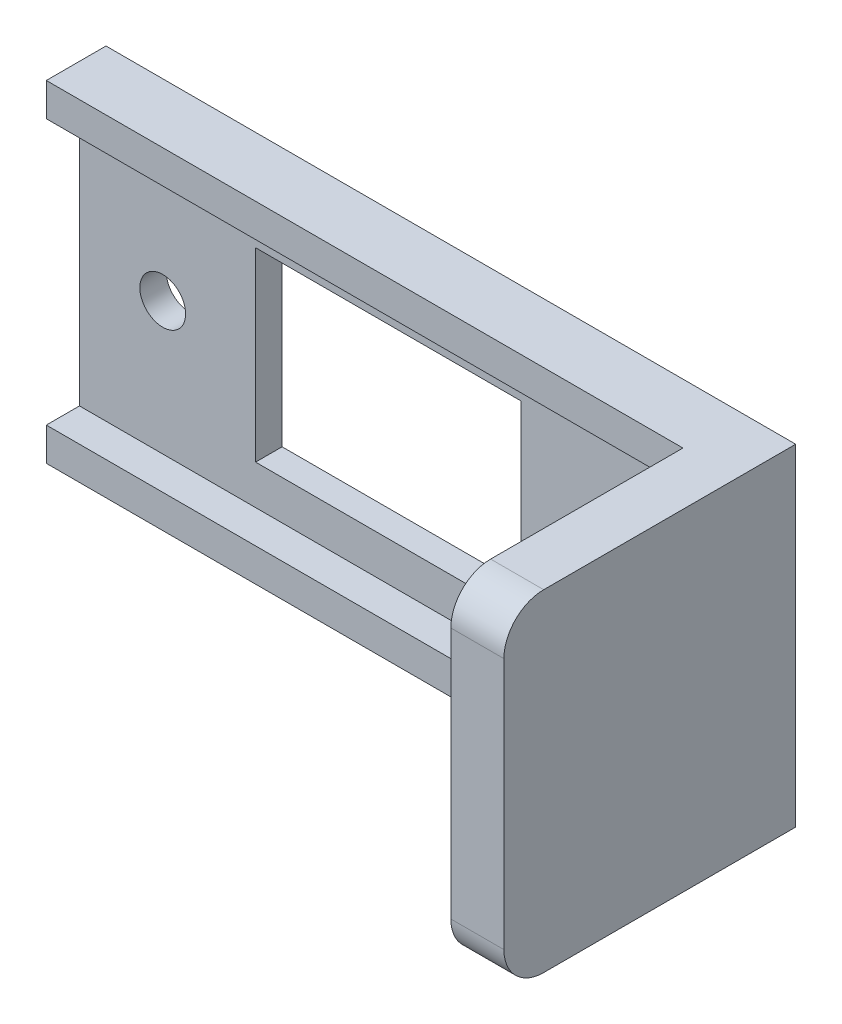
ISO-10303-21;
HEADER;
FILE_DESCRIPTION(('STEP AP214'),'2;1');
FILE_NAME('part.step','',(''),(''),'','','');
FILE_SCHEMA(('AUTOMOTIVE_DESIGN { 1 0 10303 214 1 1 1 1 }'));
ENDSEC;
DATA;
#1=APPLICATION_CONTEXT('core data for automotive mechanical design processes');
#2=APPLICATION_PROTOCOL_DEFINITION('international standard','automotive_design',2000,#1);
#3=PRODUCT_CONTEXT('',#1,'mechanical');
#4=PRODUCT('Part','Part','',(#3));
#5=PRODUCT_RELATED_PRODUCT_CATEGORY('part','',(#4));
#6=PRODUCT_DEFINITION_FORMATION('','',#4);
#7=PRODUCT_DEFINITION_CONTEXT('part definition',#1,'design');
#8=PRODUCT_DEFINITION('design','',#6,#7);
#9=PRODUCT_DEFINITION_SHAPE('','',#8);
#10=(LENGTH_UNIT() NAMED_UNIT(*) SI_UNIT(.MILLI.,.METRE.));
#11=(NAMED_UNIT(*) PLANE_ANGLE_UNIT() SI_UNIT($,.RADIAN.));
#12=(NAMED_UNIT(*) SI_UNIT($,.STERADIAN.) SOLID_ANGLE_UNIT());
#13=UNCERTAINTY_MEASURE_WITH_UNIT(LENGTH_MEASURE(1.E-05),#10,'distance_accuracy_value','');
#14=(GEOMETRIC_REPRESENTATION_CONTEXT(3) GLOBAL_UNCERTAINTY_ASSIGNED_CONTEXT((#13)) GLOBAL_UNIT_ASSIGNED_CONTEXT((#10,
#11,#12)) REPRESENTATION_CONTEXT('',''));
#15=CARTESIAN_POINT('',(0.,0.,0.));
#16=DIRECTION('',(0.,0.,1.));
#17=DIRECTION('',(1.,0.,0.));
#18=AXIS2_PLACEMENT_3D('',#15,#16,#17);
#19=CARTESIAN_POINT('',(0.,0.,2.));
#20=DIRECTION('',(0.,0.,1.));
#21=DIRECTION('',(1.,0.,0.));
#22=AXIS2_PLACEMENT_3D('',#19,#20,#21);
#23=PLANE('',#22);
#24=DIRECTION('',(0.,1.,0.));
#25=VECTOR('',#24,1.);
#26=CARTESIAN_POINT('',(33.2776958672562,-5.53104396084066,2.));
#27=LINE('',#26,#25);
#28=CARTESIAN_POINT('',(33.2776958672562,-19.5310439608407,2.));
#29=VERTEX_POINT('',#28);
#30=CARTESIAN_POINT('',(33.2776958672562,-5.53104396084066,2.));
#31=VERTEX_POINT('',#30);
#32=EDGE_CURVE('E52',#29,#31,#27,.T.);
#33=ORIENTED_EDGE('',*,*,#32,.F.);
#34=DIRECTION('',(1.,0.,0.));
#35=VECTOR('',#34,1.);
#36=CARTESIAN_POINT('',(33.2776958672562,-19.5310439608407,2.));
#37=LINE('',#36,#35);
#38=CARTESIAN_POINT('',(13.2776958672563,-19.5310439608407,2.));
#39=VERTEX_POINT('',#38);
#40=EDGE_CURVE('E168',#39,#29,#37,.T.);
#41=ORIENTED_EDGE('',*,*,#40,.F.);
#42=DIRECTION('',(0.,-1.,0.));
#43=VECTOR('',#42,1.);
#44=CARTESIAN_POINT('',(13.2776958672563,-5.53104396084067,2.));
#45=LINE('',#44,#43);
#46=CARTESIAN_POINT('',(13.2776958672563,-5.53104396084067,2.));
#47=VERTEX_POINT('',#46);
#48=EDGE_CURVE('E153',#47,#39,#45,.T.);
#49=ORIENTED_EDGE('',*,*,#48,.F.);
#50=DIRECTION('',(-1.,0.,0.));
#51=VECTOR('',#50,1.);
#52=CARTESIAN_POINT('',(33.2776958672562,-5.53104396084066,2.));
#53=LINE('',#52,#51);
#54=EDGE_CURVE('E162',#31,#47,#53,.T.);
#55=ORIENTED_EDGE('',*,*,#54,.F.);
#56=EDGE_LOOP('',(#33,#41,#49,#55));
#57=FACE_BOUND('',#56,.T.);
#58=DIRECTION('',(-1.,0.,0.));
#59=VECTOR('',#58,1.);
#60=CARTESIAN_POINT('',(48.,-2.5,2.));
#61=LINE('',#60,#59);
#62=CARTESIAN_POINT('',(48.,-2.5,2.));
#63=VERTEX_POINT('',#62);
#64=CARTESIAN_POINT('',(0.,-2.5,2.));
#65=VERTEX_POINT('',#64);
#66=EDGE_CURVE('E179',#63,#65,#61,.T.);
#67=ORIENTED_EDGE('',*,*,#66,.T.);
#68=DIRECTION('',(0.,-1.,0.));
#69=VECTOR('',#68,1.);
#70=CARTESIAN_POINT('',(0.,0.,2.));
#71=LINE('',#70,#69);
#72=CARTESIAN_POINT('',(0.,-22.5,2.));
#73=VERTEX_POINT('',#72);
#74=EDGE_CURVE('E247',#65,#73,#71,.T.);
#75=ORIENTED_EDGE('',*,*,#74,.T.);
#76=DIRECTION('',(1.,0.,0.));
#77=VECTOR('',#76,1.);
#78=CARTESIAN_POINT('',(48.,-22.5,2.));
#79=LINE('',#78,#77);
#80=CARTESIAN_POINT('',(48.,-22.5,2.));
#81=VERTEX_POINT('',#80);
#82=EDGE_CURVE('E198',#73,#81,#79,.T.);
#83=ORIENTED_EDGE('',*,*,#82,.T.);
#84=DIRECTION('',(0.,1.,0.));
#85=VECTOR('',#84,1.);
#86=CARTESIAN_POINT('',(48.,0.,2.));
#87=LINE('',#86,#85);
#88=EDGE_CURVE('E227',#81,#63,#87,.T.);
#89=ORIENTED_EDGE('',*,*,#88,.T.);
#90=EDGE_LOOP('',(#67,#75,#83,#89));
#91=FACE_BOUND('',#90,.T.);
#92=CARTESIAN_POINT('',(41.2776958672563,-12.5,2.));
#93=DIRECTION('',(0.,0.,1.));
#94=DIRECTION('',(1.,0.,0.));
#95=AXIS2_PLACEMENT_3D('',#92,#93,#94);
#96=CIRCLE('',#95,1.725);
#97=CARTESIAN_POINT('',(43.0026958672563,-12.5,2.));
#98=VERTEX_POINT('',#97);
#99=EDGE_CURVE('E220',#98,#98,#96,.T.);
#100=ORIENTED_EDGE('',*,*,#99,.F.);
#101=EDGE_LOOP('',(#100));
#102=FACE_BOUND('',#101,.T.);
#103=CARTESIAN_POINT('',(6.27769586725625,-12.5,2.));
#104=DIRECTION('',(0.,0.,1.));
#105=DIRECTION('',(1.,0.,0.));
#106=AXIS2_PLACEMENT_3D('',#103,#104,#105);
#107=CIRCLE('',#106,1.725);
#108=CARTESIAN_POINT('',(8.00269586725625,-12.5,2.));
#109=VERTEX_POINT('',#108);
#110=EDGE_CURVE('E217',#109,#109,#107,.T.);
#111=ORIENTED_EDGE('',*,*,#110,.F.);
#112=EDGE_LOOP('',(#111));
#113=FACE_BOUND('',#112,.T.);
#114=ADVANCED_FACE('F37',(#57,#91,#102,#113),#23,.T.);
#115=CARTESIAN_POINT('',(0.,0.,2.));
#116=DIRECTION('',(1.,0.,0.));
#117=DIRECTION('',(0.,1.,0.));
#118=AXIS2_PLACEMENT_3D('',#115,#116,#117);
#119=PLANE('',#118);
#120=DIRECTION('',(0.,-1.,0.));
#121=VECTOR('',#120,1.);
#122=CARTESIAN_POINT('',(0.,0.,0.));
#123=LINE('',#122,#121);
#124=CARTESIAN_POINT('',(0.,0.,0.));
#125=VERTEX_POINT('',#124);
#126=CARTESIAN_POINT('',(0.,-25.,0.));
#127=VERTEX_POINT('',#126);
#128=EDGE_CURVE('E244',#125,#127,#123,.T.);
#129=ORIENTED_EDGE('',*,*,#128,.T.);
#130=DIRECTION('',(0.,0.,-1.));
#131=VECTOR('',#130,1.);
#132=CARTESIAN_POINT('',(0.,-25.,2.));
#133=LINE('',#132,#131);
#134=CARTESIAN_POINT('',(0.,-25.,4.5));
#135=VERTEX_POINT('',#134);
#136=EDGE_CURVE('E266',#135,#127,#133,.T.);
#137=ORIENTED_EDGE('',*,*,#136,.F.);
#138=DIRECTION('',(0.,1.,0.));
#139=VECTOR('',#138,1.);
#140=CARTESIAN_POINT('',(0.,-25.,4.5));
#141=LINE('',#140,#139);
#142=CARTESIAN_POINT('',(0.,-22.5,4.5));
#143=VERTEX_POINT('',#142);
#144=EDGE_CURVE('E206',#135,#143,#141,.T.);
#145=ORIENTED_EDGE('',*,*,#144,.T.);
#146=DIRECTION('',(0.,0.,-1.));
#147=VECTOR('',#146,1.);
#148=CARTESIAN_POINT('',(0.,-22.5,4.5));
#149=LINE('',#148,#147);
#150=EDGE_CURVE('E212',#143,#73,#149,.T.);
#151=ORIENTED_EDGE('',*,*,#150,.T.);
#152=ORIENTED_EDGE('',*,*,#74,.F.);
#153=DIRECTION('',(0.,0.,-1.));
#154=VECTOR('',#153,1.);
#155=CARTESIAN_POINT('',(0.,-2.5,4.5));
#156=LINE('',#155,#154);
#157=CARTESIAN_POINT('',(0.,-2.5,4.5));
#158=VERTEX_POINT('',#157);
#159=EDGE_CURVE('E196',#158,#65,#156,.T.);
#160=ORIENTED_EDGE('',*,*,#159,.F.);
#161=DIRECTION('',(0.,1.,0.));
#162=VECTOR('',#161,1.);
#163=CARTESIAN_POINT('',(0.,0.,4.5));
#164=LINE('',#163,#162);
#165=CARTESIAN_POINT('',(0.,0.,4.5));
#166=VERTEX_POINT('',#165);
#167=EDGE_CURVE('E187',#158,#166,#164,.T.);
#168=ORIENTED_EDGE('',*,*,#167,.T.);
#169=DIRECTION('',(0.,0.,-1.));
#170=VECTOR('',#169,1.);
#171=CARTESIAN_POINT('',(0.,0.,2.));
#172=LINE('',#171,#170);
#173=EDGE_CURVE('E249',#166,#125,#172,.T.);
#174=ORIENTED_EDGE('',*,*,#173,.T.);
#175=EDGE_LOOP('',(#129,#137,#145,#151,#152,#160,#168,#174));
#176=FACE_BOUND('',#175,.T.);
#177=ADVANCED_FACE('F327',(#176),#119,.F.);
#178=CARTESIAN_POINT('',(0.,-25.,2.));
#179=DIRECTION('',(0.,1.,0.));
#180=DIRECTION('',(0.,0.,1.));
#181=AXIS2_PLACEMENT_3D('',#178,#179,#180);
#182=PLANE('',#181);
#183=DIRECTION('',(0.,0.,-1.));
#184=VECTOR('',#183,1.);
#185=CARTESIAN_POINT('',(52.,-25.,2.));
#186=LINE('',#185,#184);
#187=CARTESIAN_POINT('',(52.,-25.,19.));
#188=VERTEX_POINT('',#187);
#189=CARTESIAN_POINT('',(52.,-25.,0.));
#190=VERTEX_POINT('',#189);
#191=EDGE_CURVE('E264',#188,#190,#186,.T.);
#192=ORIENTED_EDGE('',*,*,#191,.F.);
#193=DIRECTION('',(-1.,0.,0.));
#194=VECTOR('',#193,1.);
#195=CARTESIAN_POINT('',(48.,-25.,19.));
#196=LINE('',#195,#194);
#197=CARTESIAN_POINT('',(48.,-25.,19.));
#198=VERTEX_POINT('',#197);
#199=EDGE_CURVE('E269',#188,#198,#196,.T.);
#200=ORIENTED_EDGE('',*,*,#199,.T.);
#201=DIRECTION('',(0.,0.,-1.));
#202=VECTOR('',#201,1.);
#203=CARTESIAN_POINT('',(48.,-25.,22.));
#204=LINE('',#203,#202);
#205=CARTESIAN_POINT('',(48.,-25.,4.5));
#206=VERTEX_POINT('',#205);
#207=EDGE_CURVE('E241',#198,#206,#204,.T.);
#208=ORIENTED_EDGE('',*,*,#207,.T.);
#209=DIRECTION('',(-1.,0.,0.));
#210=VECTOR('',#209,1.);
#211=CARTESIAN_POINT('',(48.,-25.,4.5));
#212=LINE('',#211,#210);
#213=EDGE_CURVE('E203',#206,#135,#212,.T.);
#214=ORIENTED_EDGE('',*,*,#213,.T.);
#215=ORIENTED_EDGE('',*,*,#136,.T.);
#216=DIRECTION('',(1.,0.,0.));
#217=VECTOR('',#216,1.);
#218=CARTESIAN_POINT('',(0.,-25.,0.));
#219=LINE('',#218,#217);
#220=EDGE_CURVE('E253',#127,#190,#219,.T.);
#221=ORIENTED_EDGE('',*,*,#220,.T.);
#222=EDGE_LOOP('',(#192,#200,#208,#214,#215,#221));
#223=FACE_BOUND('',#222,.T.);
#224=ADVANCED_FACE('F290',(#223),#182,.F.);
#225=CARTESIAN_POINT('',(52.,0.,2.));
#226=DIRECTION('',(-1.,0.,0.));
#227=DIRECTION('',(0.,0.,1.));
#228=AXIS2_PLACEMENT_3D('',#225,#226,#227);
#229=PLANE('',#228);
#230=DIRECTION('',(0.,-1.,0.));
#231=VECTOR('',#230,1.);
#232=CARTESIAN_POINT('',(52.,0.,22.));
#233=LINE('',#232,#231);
#234=CARTESIAN_POINT('',(52.,-3.,22.));
#235=VERTEX_POINT('',#234);
#236=CARTESIAN_POINT('',(52.,-22.,22.));
#237=VERTEX_POINT('',#236);
#238=EDGE_CURVE('E235',#235,#237,#233,.T.);
#239=ORIENTED_EDGE('',*,*,#238,.T.);
#240=CARTESIAN_POINT('',(52.,-22.,19.));
#241=DIRECTION('',(-1.,0.,0.));
#242=DIRECTION('',(0.,0.,1.));
#243=AXIS2_PLACEMENT_3D('',#240,#241,#242);
#244=CIRCLE('',#243,3.);
#245=EDGE_CURVE('E45',#237,#188,#244,.F.);
#246=ORIENTED_EDGE('',*,*,#245,.T.);
#247=ORIENTED_EDGE('',*,*,#191,.T.);
#248=DIRECTION('',(0.,1.,0.));
#249=VECTOR('',#248,1.);
#250=CARTESIAN_POINT('',(52.,0.,0.));
#251=LINE('',#250,#249);
#252=CARTESIAN_POINT('',(52.,0.,0.));
#253=VERTEX_POINT('',#252);
#254=EDGE_CURVE('E256',#190,#253,#251,.T.);
#255=ORIENTED_EDGE('',*,*,#254,.T.);
#256=DIRECTION('',(0.,0.,-1.));
#257=VECTOR('',#256,1.);
#258=CARTESIAN_POINT('',(52.,0.,2.));
#259=LINE('',#258,#257);
#260=CARTESIAN_POINT('',(52.,0.,19.));
#261=VERTEX_POINT('',#260);
#262=EDGE_CURVE('E262',#261,#253,#259,.T.);
#263=ORIENTED_EDGE('',*,*,#262,.F.);
#264=CARTESIAN_POINT('',(52.,-3.,19.));
#265=DIRECTION('',(-1.,0.,0.));
#266=DIRECTION('',(0.,0.,1.));
#267=AXIS2_PLACEMENT_3D('',#264,#265,#266);
#268=CIRCLE('',#267,3.);
#269=EDGE_CURVE('E280',#261,#235,#268,.F.);
#270=ORIENTED_EDGE('',*,*,#269,.T.);
#271=EDGE_LOOP('',(#239,#246,#247,#255,#263,#270));
#272=FACE_BOUND('',#271,.T.);
#273=ADVANCED_FACE('F284',(#272),#229,.F.);
#274=CARTESIAN_POINT('',(0.,0.,2.));
#275=DIRECTION('',(0.,-1.,0.));
#276=DIRECTION('',(0.,0.,-1.));
#277=AXIS2_PLACEMENT_3D('',#274,#275,#276);
#278=PLANE('',#277);
#279=ORIENTED_EDGE('',*,*,#173,.F.);
#280=DIRECTION('',(1.,0.,0.));
#281=VECTOR('',#280,1.);
#282=CARTESIAN_POINT('',(48.,0.,4.5));
#283=LINE('',#282,#281);
#284=CARTESIAN_POINT('',(48.,0.,4.5));
#285=VERTEX_POINT('',#284);
#286=EDGE_CURVE('E190',#166,#285,#283,.T.);
#287=ORIENTED_EDGE('',*,*,#286,.T.);
#288=DIRECTION('',(0.,0.,-1.));
#289=VECTOR('',#288,1.);
#290=CARTESIAN_POINT('',(48.,0.,22.));
#291=LINE('',#290,#289);
#292=CARTESIAN_POINT('',(48.,0.,19.));
#293=VERTEX_POINT('',#292);
#294=EDGE_CURVE('E238',#293,#285,#291,.T.);
#295=ORIENTED_EDGE('',*,*,#294,.F.);
#296=DIRECTION('',(1.,0.,0.));
#297=VECTOR('',#296,1.);
#298=CARTESIAN_POINT('',(52.,0.,19.));
#299=LINE('',#298,#297);
#300=EDGE_CURVE('E11',#293,#261,#299,.T.);
#301=ORIENTED_EDGE('',*,*,#300,.T.);
#302=ORIENTED_EDGE('',*,*,#262,.T.);
#303=DIRECTION('',(-1.,0.,0.));
#304=VECTOR('',#303,1.);
#305=CARTESIAN_POINT('',(0.,0.,0.));
#306=LINE('',#305,#304);
#307=EDGE_CURVE('E250',#253,#125,#306,.T.);
#308=ORIENTED_EDGE('',*,*,#307,.T.);
#309=EDGE_LOOP('',(#279,#287,#295,#301,#302,#308));
#310=FACE_BOUND('',#309,.T.);
#311=ADVANCED_FACE('F305',(#310),#278,.F.);
#312=CARTESIAN_POINT('',(0.,0.,0.));
#313=DIRECTION('',(0.,0.,1.));
#314=DIRECTION('',(1.,0.,0.));
#315=AXIS2_PLACEMENT_3D('',#312,#313,#314);
#316=PLANE('',#315);
#317=DIRECTION('',(-1.,0.,0.));
#318=VECTOR('',#317,1.);
#319=CARTESIAN_POINT('',(33.2776958672562,-19.5310439608407,0.));
#320=LINE('',#319,#318);
#321=CARTESIAN_POINT('',(33.2776958672562,-19.5310439608407,0.));
#322=VERTEX_POINT('',#321);
#323=CARTESIAN_POINT('',(13.2776958672563,-19.5310439608407,0.));
#324=VERTEX_POINT('',#323);
#325=EDGE_CURVE('E381',#322,#324,#320,.T.);
#326=ORIENTED_EDGE('',*,*,#325,.F.);
#327=DIRECTION('',(0.,-1.,0.));
#328=VECTOR('',#327,1.);
#329=CARTESIAN_POINT('',(33.2776958672562,-5.53104396084066,0.));
#330=LINE('',#329,#328);
#331=CARTESIAN_POINT('',(33.2776958672562,-5.53104396084066,0.));
#332=VERTEX_POINT('',#331);
#333=EDGE_CURVE('E180',#332,#322,#330,.T.);
#334=ORIENTED_EDGE('',*,*,#333,.F.);
#335=DIRECTION('',(1.,0.,0.));
#336=VECTOR('',#335,1.);
#337=CARTESIAN_POINT('',(33.2776958672562,-5.53104396084066,0.));
#338=LINE('',#337,#336);
#339=CARTESIAN_POINT('',(13.2776958672563,-5.53104396084067,0.));
#340=VERTEX_POINT('',#339);
#341=EDGE_CURVE('E177',#340,#332,#338,.T.);
#342=ORIENTED_EDGE('',*,*,#341,.F.);
#343=DIRECTION('',(0.,1.,0.));
#344=VECTOR('',#343,1.);
#345=CARTESIAN_POINT('',(13.2776958672563,-5.53104396084067,0.));
#346=LINE('',#345,#344);
#347=EDGE_CURVE('E156',#324,#340,#346,.T.);
#348=ORIENTED_EDGE('',*,*,#347,.F.);
#349=EDGE_LOOP('',(#326,#334,#342,#348));
#350=FACE_BOUND('',#349,.T.);
#351=CARTESIAN_POINT('',(41.2776958672563,-12.5,0.));
#352=DIRECTION('',(0.,0.,1.));
#353=DIRECTION('',(1.,0.,0.));
#354=AXIS2_PLACEMENT_3D('',#351,#352,#353);
#355=CIRCLE('',#354,1.725);
#356=CARTESIAN_POINT('',(43.0026958672563,-12.5,0.));
#357=VERTEX_POINT('',#356);
#358=EDGE_CURVE('E223',#357,#357,#355,.F.);
#359=ORIENTED_EDGE('',*,*,#358,.F.);
#360=EDGE_LOOP('',(#359));
#361=FACE_BOUND('',#360,.T.);
#362=CARTESIAN_POINT('',(6.27769586725625,-12.5,0.));
#363=DIRECTION('',(0.,0.,1.));
#364=DIRECTION('',(1.,0.,0.));
#365=AXIS2_PLACEMENT_3D('',#362,#363,#364);
#366=CIRCLE('',#365,1.725);
#367=CARTESIAN_POINT('',(8.00269586725625,-12.5,0.));
#368=VERTEX_POINT('',#367);
#369=EDGE_CURVE('E224',#368,#368,#366,.F.);
#370=ORIENTED_EDGE('',*,*,#369,.F.);
#371=EDGE_LOOP('',(#370));
#372=FACE_BOUND('',#371,.T.);
#373=ORIENTED_EDGE('',*,*,#128,.F.);
#374=ORIENTED_EDGE('',*,*,#307,.F.);
#375=ORIENTED_EDGE('',*,*,#254,.F.);
#376=ORIENTED_EDGE('',*,*,#220,.F.);
#377=EDGE_LOOP('',(#373,#374,#375,#376));
#378=FACE_BOUND('',#377,.T.);
#379=ADVANCED_FACE('F330',(#350,#361,#372,#378),#316,.F.);
#380=CARTESIAN_POINT('',(48.,0.,22.));
#381=DIRECTION('',(-1.,0.,0.));
#382=DIRECTION('',(0.,0.,1.));
#383=AXIS2_PLACEMENT_3D('',#380,#381,#382);
#384=PLANE('',#383);
#385=DIRECTION('',(0.,0.,-1.));
#386=VECTOR('',#385,1.);
#387=CARTESIAN_POINT('',(48.,-2.5,4.5));
#388=LINE('',#387,#386);
#389=CARTESIAN_POINT('',(48.,-2.5,4.5));
#390=VERTEX_POINT('',#389);
#391=EDGE_CURVE('E193',#390,#63,#388,.T.);
#392=ORIENTED_EDGE('',*,*,#391,.T.);
#393=ORIENTED_EDGE('',*,*,#88,.F.);
#394=DIRECTION('',(0.,0.,-1.));
#395=VECTOR('',#394,1.);
#396=CARTESIAN_POINT('',(48.,-22.5,4.5));
#397=LINE('',#396,#395);
#398=CARTESIAN_POINT('',(48.,-22.5,4.5));
#399=VERTEX_POINT('',#398);
#400=EDGE_CURVE('E214',#399,#81,#397,.T.);
#401=ORIENTED_EDGE('',*,*,#400,.F.);
#402=DIRECTION('',(0.,-1.,0.));
#403=VECTOR('',#402,1.);
#404=CARTESIAN_POINT('',(48.,-25.,4.5));
#405=LINE('',#404,#403);
#406=EDGE_CURVE('E201',#399,#206,#405,.T.);
#407=ORIENTED_EDGE('',*,*,#406,.T.);
#408=ORIENTED_EDGE('',*,*,#207,.F.);
#409=CARTESIAN_POINT('',(48.,-22.,19.));
#410=DIRECTION('',(-1.,0.,0.));
#411=DIRECTION('',(0.,0.,1.));
#412=AXIS2_PLACEMENT_3D('',#409,#410,#411);
#413=CIRCLE('',#412,3.);
#414=CARTESIAN_POINT('',(48.,-22.,22.));
#415=VERTEX_POINT('',#414);
#416=EDGE_CURVE('E274',#198,#415,#413,.T.);
#417=ORIENTED_EDGE('',*,*,#416,.T.);
#418=DIRECTION('',(0.,1.,0.));
#419=VECTOR('',#418,1.);
#420=CARTESIAN_POINT('',(48.,0.,22.));
#421=LINE('',#420,#419);
#422=CARTESIAN_POINT('',(48.,-3.,22.));
#423=VERTEX_POINT('',#422);
#424=EDGE_CURVE('E232',#415,#423,#421,.T.);
#425=ORIENTED_EDGE('',*,*,#424,.T.);
#426=CARTESIAN_POINT('',(48.,-3.,19.));
#427=DIRECTION('',(-1.,0.,0.));
#428=DIRECTION('',(0.,0.,1.));
#429=AXIS2_PLACEMENT_3D('',#426,#427,#428);
#430=CIRCLE('',#429,3.);
#431=EDGE_CURVE('E272',#423,#293,#430,.T.);
#432=ORIENTED_EDGE('',*,*,#431,.T.);
#433=ORIENTED_EDGE('',*,*,#294,.T.);
#434=DIRECTION('',(0.,-1.,0.));
#435=VECTOR('',#434,1.);
#436=CARTESIAN_POINT('',(48.,0.,4.5));
#437=LINE('',#436,#435);
#438=EDGE_CURVE('E181',#285,#390,#437,.T.);
#439=ORIENTED_EDGE('',*,*,#438,.T.);
#440=EDGE_LOOP('',(#392,#393,#401,#407,#408,#417,#425,#432,#433,#439));
#441=FACE_BOUND('',#440,.T.);
#442=ADVANCED_FACE('F296',(#441),#384,.T.);
#443=CARTESIAN_POINT('',(0.,0.,22.));
#444=DIRECTION('',(0.,0.,1.));
#445=DIRECTION('',(1.,0.,0.));
#446=AXIS2_PLACEMENT_3D('',#443,#444,#445);
#447=PLANE('',#446);
#448=ORIENTED_EDGE('',*,*,#424,.F.);
#449=DIRECTION('',(-1.,0.,0.));
#450=VECTOR('',#449,1.);
#451=CARTESIAN_POINT('',(52.,-22.,22.));
#452=LINE('',#451,#450);
#453=EDGE_CURVE('E278',#415,#237,#452,.F.);
#454=ORIENTED_EDGE('',*,*,#453,.T.);
#455=ORIENTED_EDGE('',*,*,#238,.F.);
#456=DIRECTION('',(1.,0.,0.));
#457=VECTOR('',#456,1.);
#458=CARTESIAN_POINT('',(48.,-3.,22.));
#459=LINE('',#458,#457);
#460=EDGE_CURVE('E276',#235,#423,#459,.F.);
#461=ORIENTED_EDGE('',*,*,#460,.T.);
#462=EDGE_LOOP('',(#448,#454,#455,#461));
#463=FACE_BOUND('',#462,.T.);
#464=ADVANCED_FACE('F299',(#463),#447,.T.);
#465=CARTESIAN_POINT('',(0.,-22.,19.));
#466=DIRECTION('',(1.,0.,0.));
#467=DIRECTION('',(0.,0.,-1.));
#468=AXIS2_PLACEMENT_3D('',#465,#466,#467);
#469=CYLINDRICAL_SURFACE('',#468,3.);
#470=ORIENTED_EDGE('',*,*,#245,.F.);
#471=ORIENTED_EDGE('',*,*,#453,.F.);
#472=ORIENTED_EDGE('',*,*,#416,.F.);
#473=ORIENTED_EDGE('',*,*,#199,.F.);
#474=EDGE_LOOP('',(#470,#471,#472,#473));
#475=FACE_BOUND('',#474,.T.);
#476=ADVANCED_FACE('F293',(#475),#469,.T.);
#477=CARTESIAN_POINT('',(0.,-3.,19.));
#478=DIRECTION('',(-1.,0.,0.));
#479=DIRECTION('',(0.,0.,1.));
#480=AXIS2_PLACEMENT_3D('',#477,#478,#479);
#481=CYLINDRICAL_SURFACE('',#480,3.);
#482=ORIENTED_EDGE('',*,*,#431,.F.);
#483=ORIENTED_EDGE('',*,*,#460,.F.);
#484=ORIENTED_EDGE('',*,*,#269,.F.);
#485=ORIENTED_EDGE('',*,*,#300,.F.);
#486=EDGE_LOOP('',(#482,#483,#484,#485));
#487=FACE_BOUND('',#486,.T.);
#488=ADVANCED_FACE('F39',(#487),#481,.T.);
#489=CARTESIAN_POINT('',(6.27769586725625,-12.5,-4.87903679018718));
#490=DIRECTION('',(0.,0.,1.));
#491=DIRECTION('',(1.,0.,0.));
#492=AXIS2_PLACEMENT_3D('',#489,#490,#491);
#493=CYLINDRICAL_SURFACE('',#492,1.725);
#494=ORIENTED_EDGE('',*,*,#369,.T.);
#495=EDGE_LOOP('',(#494));
#496=FACE_BOUND('',#495,.T.);
#497=ORIENTED_EDGE('',*,*,#110,.T.);
#498=EDGE_LOOP('',(#497));
#499=FACE_BOUND('',#498,.T.);
#500=ADVANCED_FACE('F351',(#496,#499),#493,.F.);
#501=CARTESIAN_POINT('',(41.2776958672563,-12.5,-4.87903679018718));
#502=DIRECTION('',(0.,0.,1.));
#503=DIRECTION('',(1.,0.,0.));
#504=AXIS2_PLACEMENT_3D('',#501,#502,#503);
#505=CYLINDRICAL_SURFACE('',#504,1.725);
#506=ORIENTED_EDGE('',*,*,#358,.T.);
#507=EDGE_LOOP('',(#506));
#508=FACE_BOUND('',#507,.T.);
#509=ORIENTED_EDGE('',*,*,#99,.T.);
#510=EDGE_LOOP('',(#509));
#511=FACE_BOUND('',#510,.T.);
#512=ADVANCED_FACE('F354',(#508,#511),#505,.F.);
#513=CARTESIAN_POINT('',(48.,-22.5,4.5));
#514=DIRECTION('',(0.,1.,0.));
#515=DIRECTION('',(0.,0.,1.));
#516=AXIS2_PLACEMENT_3D('',#513,#514,#515);
#517=PLANE('',#516);
#518=ORIENTED_EDGE('',*,*,#82,.F.);
#519=ORIENTED_EDGE('',*,*,#150,.F.);
#520=DIRECTION('',(1.,0.,0.));
#521=VECTOR('',#520,1.);
#522=CARTESIAN_POINT('',(48.,-22.5,4.5));
#523=LINE('',#522,#521);
#524=EDGE_CURVE('E209',#143,#399,#523,.T.);
#525=ORIENTED_EDGE('',*,*,#524,.T.);
#526=ORIENTED_EDGE('',*,*,#400,.T.);
#527=EDGE_LOOP('',(#518,#519,#525,#526));
#528=FACE_BOUND('',#527,.T.);
#529=ADVANCED_FACE('F318',(#528),#517,.T.);
#530=CARTESIAN_POINT('',(0.,0.,4.5));
#531=DIRECTION('',(0.,0.,1.));
#532=DIRECTION('',(1.,0.,0.));
#533=AXIS2_PLACEMENT_3D('',#530,#531,#532);
#534=PLANE('',#533);
#535=ORIENTED_EDGE('',*,*,#406,.F.);
#536=ORIENTED_EDGE('',*,*,#524,.F.);
#537=ORIENTED_EDGE('',*,*,#144,.F.);
#538=ORIENTED_EDGE('',*,*,#213,.F.);
#539=EDGE_LOOP('',(#535,#536,#537,#538));
#540=FACE_BOUND('',#539,.T.);
#541=ADVANCED_FACE('F323',(#540),#534,.T.);
#542=CARTESIAN_POINT('',(48.,-2.5,4.5));
#543=DIRECTION('',(0.,-1.,0.));
#544=DIRECTION('',(0.,0.,-1.));
#545=AXIS2_PLACEMENT_3D('',#542,#543,#544);
#546=PLANE('',#545);
#547=ORIENTED_EDGE('',*,*,#66,.F.);
#548=ORIENTED_EDGE('',*,*,#391,.F.);
#549=DIRECTION('',(-1.,0.,0.));
#550=VECTOR('',#549,1.);
#551=CARTESIAN_POINT('',(48.,-2.5,4.5));
#552=LINE('',#551,#550);
#553=EDGE_CURVE('E184',#390,#158,#552,.T.);
#554=ORIENTED_EDGE('',*,*,#553,.T.);
#555=ORIENTED_EDGE('',*,*,#159,.T.);
#556=EDGE_LOOP('',(#547,#548,#554,#555));
#557=FACE_BOUND('',#556,.T.);
#558=ADVANCED_FACE('F363',(#557),#546,.T.);
#559=CARTESIAN_POINT('',(0.,0.,4.5));
#560=DIRECTION('',(0.,0.,-1.));
#561=DIRECTION('',(-1.,0.,0.));
#562=AXIS2_PLACEMENT_3D('',#559,#560,#561);
#563=PLANE('',#562);
#564=ORIENTED_EDGE('',*,*,#438,.F.);
#565=ORIENTED_EDGE('',*,*,#286,.F.);
#566=ORIENTED_EDGE('',*,*,#167,.F.);
#567=ORIENTED_EDGE('',*,*,#553,.F.);
#568=EDGE_LOOP('',(#564,#565,#566,#567));
#569=FACE_BOUND('',#568,.T.);
#570=ADVANCED_FACE('F310',(#569),#563,.F.);
#571=CARTESIAN_POINT('',(33.2776958672562,-5.53104396084066,-24.4131112314674));
#572=DIRECTION('',(1.,0.,0.));
#573=DIRECTION('',(0.,1.,0.));
#574=AXIS2_PLACEMENT_3D('',#571,#572,#573);
#575=PLANE('',#574);
#576=ORIENTED_EDGE('',*,*,#333,.T.);
#577=DIRECTION('',(0.,0.,1.));
#578=VECTOR('',#577,1.);
#579=CARTESIAN_POINT('',(33.2776958672562,-19.5310439608407,-24.4131112314674));
#580=LINE('',#579,#578);
#581=EDGE_CURVE('E173',#322,#29,#580,.T.);
#582=ORIENTED_EDGE('',*,*,#581,.T.);
#583=ORIENTED_EDGE('',*,*,#32,.T.);
#584=DIRECTION('',(0.,0.,1.));
#585=VECTOR('',#584,1.);
#586=CARTESIAN_POINT('',(33.2776958672562,-5.53104396084066,-24.4131112314674));
#587=LINE('',#586,#585);
#588=EDGE_CURVE('E159',#332,#31,#587,.T.);
#589=ORIENTED_EDGE('',*,*,#588,.F.);
#590=EDGE_LOOP('',(#576,#582,#583,#589));
#591=FACE_BOUND('',#590,.T.);
#592=ADVANCED_FACE('F368',(#591),#575,.F.);
#593=CARTESIAN_POINT('',(33.2776958672562,-19.5310439608407,-24.4131112314674));
#594=DIRECTION('',(0.,-1.,0.));
#595=DIRECTION('',(1.,0.,0.));
#596=AXIS2_PLACEMENT_3D('',#593,#594,#595);
#597=PLANE('',#596);
#598=ORIENTED_EDGE('',*,*,#325,.T.);
#599=DIRECTION('',(0.,0.,1.));
#600=VECTOR('',#599,1.);
#601=CARTESIAN_POINT('',(13.2776958672563,-19.5310439608407,-24.4131112314674));
#602=LINE('',#601,#600);
#603=EDGE_CURVE('E158',#324,#39,#602,.T.);
#604=ORIENTED_EDGE('',*,*,#603,.T.);
#605=ORIENTED_EDGE('',*,*,#40,.T.);
#606=ORIENTED_EDGE('',*,*,#581,.F.);
#607=EDGE_LOOP('',(#598,#604,#605,#606));
#608=FACE_BOUND('',#607,.T.);
#609=ADVANCED_FACE('F371',(#608),#597,.F.);
#610=CARTESIAN_POINT('',(13.2776958672563,-5.53104396084067,-24.4131112314674));
#611=DIRECTION('',(-1.,0.,0.));
#612=DIRECTION('',(0.,-1.,0.));
#613=AXIS2_PLACEMENT_3D('',#610,#611,#612);
#614=PLANE('',#613);
#615=ORIENTED_EDGE('',*,*,#347,.T.);
#616=DIRECTION('',(0.,0.,1.));
#617=VECTOR('',#616,1.);
#618=CARTESIAN_POINT('',(13.2776958672563,-5.53104396084067,-24.4131112314674));
#619=LINE('',#618,#617);
#620=EDGE_CURVE('E60',#340,#47,#619,.T.);
#621=ORIENTED_EDGE('',*,*,#620,.T.);
#622=ORIENTED_EDGE('',*,*,#48,.T.);
#623=ORIENTED_EDGE('',*,*,#603,.F.);
#624=EDGE_LOOP('',(#615,#621,#622,#623));
#625=FACE_BOUND('',#624,.T.);
#626=ADVANCED_FACE('F150',(#625),#614,.F.);
#627=CARTESIAN_POINT('',(33.2776958672562,-5.53104396084066,-24.4131112314674));
#628=DIRECTION('',(0.,1.,0.));
#629=DIRECTION('',(-1.,0.,0.));
#630=AXIS2_PLACEMENT_3D('',#627,#628,#629);
#631=PLANE('',#630);
#632=ORIENTED_EDGE('',*,*,#341,.T.);
#633=ORIENTED_EDGE('',*,*,#588,.T.);
#634=ORIENTED_EDGE('',*,*,#54,.T.);
#635=ORIENTED_EDGE('',*,*,#620,.F.);
#636=EDGE_LOOP('',(#632,#633,#634,#635));
#637=FACE_BOUND('',#636,.T.);
#638=ADVANCED_FACE('F163',(#637),#631,.F.);
#639=CLOSED_SHELL('',(#114,#177,#224,#273,#311,#379,#442,#464,#476,#488,#500,#512,#529,#541,
#558,#570,#592,#609,#626,#638));
#640=MANIFOLD_SOLID_BREP('B2',#639);
#641=ADVANCED_BREP_SHAPE_REPRESENTATION('',(#18,#640),#14);
#642=SHAPE_DEFINITION_REPRESENTATION(#9,#641);
ENDSEC;
END-ISO-10303-21;
